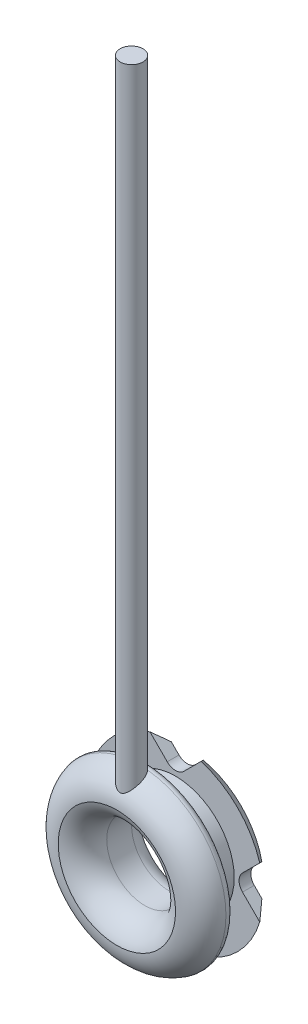
ISO-10303-21;
HEADER;
FILE_DESCRIPTION(('STEP AP214'),'2;1');
FILE_NAME('part.step','',(''),(''),'','','');
FILE_SCHEMA(('AUTOMOTIVE_DESIGN { 1 0 10303 214 1 1 1 1 }'));
ENDSEC;
DATA;
#1=APPLICATION_CONTEXT('core data for automotive mechanical design processes');
#2=APPLICATION_PROTOCOL_DEFINITION('international standard','automotive_design',2000,#1);
#3=PRODUCT_CONTEXT('',#1,'mechanical');
#4=PRODUCT('Part','Part','',(#3));
#5=PRODUCT_RELATED_PRODUCT_CATEGORY('part','',(#4));
#6=PRODUCT_DEFINITION_FORMATION('','',#4);
#7=PRODUCT_DEFINITION_CONTEXT('part definition',#1,'design');
#8=PRODUCT_DEFINITION('design','',#6,#7);
#9=PRODUCT_DEFINITION_SHAPE('','',#8);
#10=(LENGTH_UNIT() NAMED_UNIT(*) SI_UNIT(.MILLI.,.METRE.));
#11=(NAMED_UNIT(*) PLANE_ANGLE_UNIT() SI_UNIT($,.RADIAN.));
#12=(NAMED_UNIT(*) SI_UNIT($,.STERADIAN.) SOLID_ANGLE_UNIT());
#13=UNCERTAINTY_MEASURE_WITH_UNIT(LENGTH_MEASURE(1.E-05),#10,'distance_accuracy_value','');
#14=(GEOMETRIC_REPRESENTATION_CONTEXT(3) GLOBAL_UNCERTAINTY_ASSIGNED_CONTEXT((#13)) GLOBAL_UNIT_ASSIGNED_CONTEXT((#10,
#11,#12)) REPRESENTATION_CONTEXT('',''));
#15=CARTESIAN_POINT('',(0.,0.,0.));
#16=DIRECTION('',(0.,0.,1.));
#17=DIRECTION('',(1.,0.,0.));
#18=AXIS2_PLACEMENT_3D('',#15,#16,#17);
#19=CARTESIAN_POINT('',(0.,0.,0.5));
#20=DIRECTION('',(0.,0.,1.));
#21=DIRECTION('',(1.,0.,0.));
#22=AXIS2_PLACEMENT_3D('',#19,#20,#21);
#23=TOROIDAL_SURFACE('',#22,1.,0.5);
#24=CARTESIAN_POINT('',(0.,0.,1.));
#25=DIRECTION('',(0.,0.,1.));
#26=DIRECTION('',(1.,0.,0.));
#27=AXIS2_PLACEMENT_3D('',#24,#25,#26);
#28=CIRCLE('',#27,1.);
#29=CARTESIAN_POINT('',(1.,0.,1.));
#30=VERTEX_POINT('',#29);
#31=EDGE_CURVE('E190',#30,#30,#28,.T.);
#32=ORIENTED_EDGE('',*,*,#31,.F.);
#33=EDGE_LOOP('',(#32));
#34=FACE_BOUND('',#33,.T.);
#35=CARTESIAN_POINT('',(0.,0.,0.625));
#36=DIRECTION('',(0.,0.,-1.));
#37=DIRECTION('',(-1.,0.,0.));
#38=AXIS2_PLACEMENT_3D('',#35,#36,#37);
#39=CIRCLE('',#38,1.48412291827593);
#40=CARTESIAN_POINT('',(-0.149666295471074,1.4765570888225,0.625000000000124));
#41=VERTEX_POINT('',#40);
#42=CARTESIAN_POINT('',(0.149666295470958,1.47655708882246,0.625));
#43=VERTEX_POINT('',#42);
#44=EDGE_CURVE('E178',#41,#43,#39,.F.);
#45=ORIENTED_EDGE('',*,*,#44,.T.);
#46=CARTESIAN_POINT('',(0.149499030097189,1.4766258930363,0.6248));
#47=CARTESIAN_POINT('',(0.156696979301683,1.47368439659809,0.633374210355111));
#48=CARTESIAN_POINT('',(0.163061163340651,1.47036924902463,0.642493157271564));
#49=CARTESIAN_POINT('',(0.174047735758035,1.46302975629054,0.661400727866024));
#50=CARTESIAN_POINT('',(0.178678670944253,1.45900903864033,0.671185776576574));
#51=CARTESIAN_POINT('',(0.18619214272015,1.45027271715954,0.691085184626072));
#52=CARTESIAN_POINT('',(0.189077079156947,1.44555807825158,0.70119907172825));
#53=CARTESIAN_POINT('',(0.193175666338337,1.43548661995578,0.721452113909226));
#54=CARTESIAN_POINT('',(0.194387549544925,1.43012912789266,0.73159128439135));
#55=CARTESIAN_POINT('',(0.195285259185459,1.41840539297856,0.752416545205257));
#56=CARTESIAN_POINT('',(0.1948417092643,1.41199277931789,0.763081788000562));
#57=CARTESIAN_POINT('',(0.192322492696541,1.39863478916131,0.783863720708152));
#58=CARTESIAN_POINT('',(0.190246519586124,1.39168931284912,0.793980307236911));
#59=CARTESIAN_POINT('',(0.184218211370251,1.3762765318613,0.815008926716112));
#60=CARTESIAN_POINT('',(0.180024816348121,1.36774025963456,0.825801014695187));
#61=CARTESIAN_POINT('',(0.169962407236064,1.35030479558493,0.846271482068112));
#62=CARTESIAN_POINT('',(0.164090682173478,1.34140503672721,0.855948023764908));
#63=CARTESIAN_POINT('',(0.149708057905441,1.32192072218834,0.875642552382461));
#64=CARTESIAN_POINT('',(0.140916387586312,1.31131089452762,0.885430351700753));
#65=CARTESIAN_POINT('',(0.121378412897694,1.29038168528772,0.903189528623968));
#66=CARTESIAN_POINT('',(0.110635727001244,1.28006180619781,0.911164208301203));
#67=CARTESIAN_POINT('',(0.0928839133125625,1.26549418342858,0.921593397056493));
#68=CARTESIAN_POINT('',(0.086694043734059,1.26079056350767,0.92481419340766));
#69=CARTESIAN_POINT('',(0.0736890564923208,1.25190584251148,0.930681603016248));
#70=CARTESIAN_POINT('',(0.0668744348373626,1.24772433304259,0.933328666254309));
#71=CARTESIAN_POINT('',(0.0539396234627459,1.24095134875973,0.937489467275872));
#72=CARTESIAN_POINT('',(0.0479390439805197,1.23820875183827,0.939123324726593));
#73=CARTESIAN_POINT('',(0.0355055147174685,1.23355803913689,0.941845186746187));
#74=CARTESIAN_POINT('',(0.0290736112385078,1.23164798265763,0.942934461649758));
#75=CARTESIAN_POINT('',(0.0171465296035864,1.22920053941878,0.944319043688463));
#76=CARTESIAN_POINT('',(0.0117044602388746,1.22847177519864,0.944725601789662));
#77=CARTESIAN_POINT('',(0.000758519440309293,1.22784572312433,0.945075211732738));
#78=CARTESIAN_POINT('',(-0.00474531146339857,1.22794791856991,0.945018551608893));
#79=CARTESIAN_POINT('',(-0.0156355429490688,1.22896676377188,0.944448546746555));
#80=CARTESIAN_POINT('',(-0.0210222032834489,1.2298813715348,0.943936347000104));
#81=CARTESIAN_POINT('',(-0.0315728581818736,1.23240573184491,0.94250091794956));
#82=CARTESIAN_POINT('',(-0.0367365677026245,1.23401634688864,0.941577178618949));
#83=CARTESIAN_POINT('',(-0.0497794695040224,1.23890064991985,0.938718036435945));
#84=CARTESIAN_POINT('',(-0.0574394637752494,1.24259315862571,0.936507898114206));
#85=CARTESIAN_POINT('',(-0.0720362078583338,1.25082050883386,0.931372588774388));
#86=CARTESIAN_POINT('',(-0.078970212376156,1.25535837921679,0.928444834280621));
#87=CARTESIAN_POINT('',(-0.0969865294664841,1.26838595352085,0.919647234114758));
#88=CARTESIAN_POINT('',(-0.107430158662038,1.27735484190092,0.913183608903892));
#89=CARTESIAN_POINT('',(-0.126677041761067,1.29578676130787,0.89873596026507));
#90=CARTESIAN_POINT('',(-0.13547820299235,1.30525040332337,0.890750023077778));
#91=CARTESIAN_POINT('',(-0.151940401398813,1.32476765329214,0.872861381991615));
#92=CARTESIAN_POINT('',(-0.159508275145962,1.33482423712595,0.862875565706607));
#93=CARTESIAN_POINT('',(-0.172692641491739,1.35462932692126,0.841434374478199));
#94=CARTESIAN_POINT('',(-0.178311247236968,1.36437815601949,0.829980609466349));
#95=CARTESIAN_POINT('',(-0.186878535487946,1.38241093404366,0.806905846211039));
#96=CARTESIAN_POINT('',(-0.190027699364597,1.39074663078586,0.795400562919765));
#97=CARTESIAN_POINT('',(-0.19418294361917,1.40674549798854,0.771548535870156));
#98=CARTESIAN_POINT('',(-0.195189004334693,1.41440866227809,0.759201784392649));
#99=CARTESIAN_POINT('',(-0.194750510114056,1.42893266753431,0.733929026444996));
#100=CARTESIAN_POINT('',(-0.193284609893565,1.43578596767769,0.720998922550205));
#101=CARTESIAN_POINT('',(-0.18761240397004,1.44843115147158,0.695230746926723));
#102=CARTESIAN_POINT('',(-0.183412294670209,1.45422539726877,0.682392533300973));
#103=CARTESIAN_POINT('',(-0.174224946408738,1.46277755824538,0.661981538374541));
#104=CARTESIAN_POINT('',(-0.170062400883219,1.46587851139698,0.654173900109877));
#105=CARTESIAN_POINT('',(-0.160614637583342,1.47160878314234,0.639058843665036));
#106=CARTESIAN_POINT('',(-0.155327117243196,1.47423711371215,0.631752492695069));
#107=CARTESIAN_POINT('',(-0.149499030097188,1.4766258930363,0.6248));
#108=B_SPLINE_CURVE_WITH_KNOTS('',3,(#46,#47,#48,#49,#50,#51,#52,#53,#54,#55,#56,#57,#58,#59,
#60,#61,#62,#63,#64,#65,#66,#67,#68,#69,#70,#71,#72,#73,#74,#75,#76,#77,#78,#79,#80,#81,#82,#83,
#84,#85,#86,#87,#88,#89,#90,#91,#92,#93,#94,#95,#96,#97,#98,#99,#100,#101,#102,#103,#104,#105,
#106,#107),.UNSPECIFIED.,.F.,.F.,(4,2,2,2,2,2,2,2,2,2,2,2,2,2,2,2,2,2,2,2,2,2,2,2,2,2,2,2,2,2,
4),(0.,0.0346495677325266,0.0691259509289017,0.103554838631151,0.138020071810603,
0.175233219256427,0.212453354600247,0.255445602119331,0.298507690437271,0.349014482543497,
0.399428540897326,0.424632939280351,0.449817497665081,0.470144068097087,0.490422999373991,
0.506863847523982,0.523294473348444,0.539683917388232,0.556093729833186,0.582299956154269,
0.608601949601515,0.653979658112872,0.699414793527063,0.747430851072702,0.795394691905309,
0.838875015317358,0.882355737648071,0.926213839906042,0.969972893108465,0.998013247310488,
1.02611155551373),.UNSPECIFIED.);
#109=EDGE_CURVE('E51',#43,#41,#108,.T.);
#110=ORIENTED_EDGE('',*,*,#109,.T.);
#111=EDGE_LOOP('',(#45,#110));
#112=FACE_BOUND('',#111,.T.);
#113=ADVANCED_FACE('F32',(#34,#112),#23,.T.);
#114=CARTESIAN_POINT('',(0.,0.,0.6));
#115=DIRECTION('',(0.,0.,1.));
#116=DIRECTION('',(1.,0.,0.));
#117=AXIS2_PLACEMENT_3D('',#114,#115,#116);
#118=TOROIDAL_SURFACE('',#117,1.38729833462074,0.1);
#119=CARTESIAN_POINT('',(0.,0.,0.5));
#120=DIRECTION('',(0.,0.,1.));
#121=DIRECTION('',(1.,0.,0.));
#122=AXIS2_PLACEMENT_3D('',#119,#120,#121);
#123=CIRCLE('',#122,1.38729833462074);
#124=CARTESIAN_POINT('',(1.38729833462074,0.,0.5));
#125=VERTEX_POINT('',#124);
#126=EDGE_CURVE('E183',#125,#125,#123,.F.);
#127=ORIENTED_EDGE('',*,*,#126,.F.);
#128=EDGE_LOOP('',(#127));
#129=FACE_BOUND('',#128,.T.);
#130=ORIENTED_EDGE('',*,*,#44,.F.);
#131=CARTESIAN_POINT('',(-0.149833107155929,1.4764880444294,0.6252));
#132=CARTESIAN_POINT('',(-0.14452416364624,1.47869843083817,0.618800225346473));
#133=CARTESIAN_POINT('',(-0.138696516749939,1.48019238657561,0.612659136835366));
#134=CARTESIAN_POINT('',(-0.126257157565789,1.482100911887,0.601159814527972));
#135=CARTESIAN_POINT('',(-0.119653735409518,1.48252597042339,0.595794464203463));
#136=CARTESIAN_POINT('',(-0.104317452997589,1.48269590001264,0.584924281690223));
#137=CARTESIAN_POINT('',(-0.0954317691829694,1.48227517200432,0.579636747330142));
#138=CARTESIAN_POINT('',(-0.0769371796756487,1.48100259357276,0.570521935574666));
#139=CARTESIAN_POINT('',(-0.0673256050021827,1.48014907891991,0.566700395887298));
#140=CARTESIAN_POINT('',(-0.0474244773197394,1.47852782356893,0.560563163846049));
#141=CARTESIAN_POINT('',(-0.0371256063919043,1.47776198560329,0.558276971309993));
#142=CARTESIAN_POINT('',(-0.0162865143726189,1.47676246680102,0.555397846310613));
#143=CARTESIAN_POINT('',(-0.00574687436684022,1.47652761842958,0.554801198162191));
#144=CARTESIAN_POINT('',(0.0153544653302465,1.47671872238743,0.555317153479755));
#145=CARTESIAN_POINT('',(0.0259158350607343,1.47714913836621,0.556441302295828));
#146=CARTESIAN_POINT('',(0.0467146249399754,1.47843857552947,0.560381430899113));
#147=CARTESIAN_POINT('',(0.0569510989660962,1.47929874461609,0.56320194593968));
#148=CARTESIAN_POINT('',(0.0769739970457121,1.48096663938371,0.570513884552153));
#149=CARTESIAN_POINT('',(0.0867522842860845,1.4817734799595,0.575027778806194));
#150=CARTESIAN_POINT('',(0.105426896536981,1.48268861176828,0.5856093325553));
#151=CARTESIAN_POINT('',(0.114327402758475,1.48280038954247,0.591669078035132));
#152=CARTESIAN_POINT('',(0.127637832052235,1.48187173334083,0.602436994397496));
#153=CARTESIAN_POINT('',(0.132422709245339,1.48127316306675,0.606719967376661));
#154=CARTESIAN_POINT('',(0.141517332996463,1.47941791684281,0.615688853643923));
#155=CARTESIAN_POINT('',(0.145823741605626,1.47815693113135,0.620377235689106));
#156=CARTESIAN_POINT('',(0.149833107155929,1.4764880444294,0.6252));
#157=B_SPLINE_CURVE_WITH_KNOTS('',3,(#131,#132,#133,#134,#135,#136,#137,#138,#139,#140,#141,
#142,#143,#144,#145,#146,#147,#148,#149,#150,#151,#152,#153,#154,#155,#156),.UNSPECIFIED.,.F.,
.F.,(4,2,2,2,2,2,2,2,2,2,2,2,4),(0.,0.0256834918135602,0.0511139533848748,0.0820034292526581,
0.113012598066916,0.144601715795469,0.176121307848155,0.207853303222247,0.239670513901319,
0.271925789212535,0.304019135744154,0.32330946064791,0.342726874377861),.UNSPECIFIED.);
#158=EDGE_CURVE('E11',#41,#43,#157,.T.);
#159=ORIENTED_EDGE('',*,*,#158,.T.);
#160=EDGE_LOOP('',(#130,#159));
#161=FACE_BOUND('',#160,.T.);
#162=ADVANCED_FACE('F182',(#129,#161),#118,.T.);
#163=CARTESIAN_POINT('',(0.,0.,0.5));
#164=DIRECTION('',(0.,0.,-1.));
#165=DIRECTION('',(-1.,0.,0.));
#166=AXIS2_PLACEMENT_3D('',#163,#164,#165);
#167=CYLINDRICAL_SURFACE('',#166,1.);
#168=CARTESIAN_POINT('',(0.,0.,0.5));
#169=DIRECTION('',(0.,0.,1.));
#170=DIRECTION('',(1.,0.,0.));
#171=AXIS2_PLACEMENT_3D('',#168,#169,#170);
#172=CIRCLE('',#171,1.);
#173=CARTESIAN_POINT('',(1.,0.,0.5));
#174=VERTEX_POINT('',#173);
#175=EDGE_CURVE('E400',#174,#174,#172,.T.);
#176=ORIENTED_EDGE('',*,*,#175,.F.);
#177=EDGE_LOOP('',(#176));
#178=FACE_BOUND('',#177,.T.);
#179=CARTESIAN_POINT('',(0.,0.,0.));
#180=DIRECTION('',(0.,0.,1.));
#181=DIRECTION('',(1.,0.,0.));
#182=AXIS2_PLACEMENT_3D('',#179,#180,#181);
#183=CIRCLE('',#182,1.);
#184=CARTESIAN_POINT('',(1.,0.,0.));
#185=VERTEX_POINT('',#184);
#186=CARTESIAN_POINT('',(0.,1.,0.));
#187=VERTEX_POINT('',#186);
#188=EDGE_CURVE('E403',#185,#187,#183,.T.);
#189=ORIENTED_EDGE('',*,*,#188,.T.);
#190=CARTESIAN_POINT('',(-1.,0.,0.));
#191=VERTEX_POINT('',#190);
#192=EDGE_CURVE('E405',#187,#191,#183,.T.);
#193=ORIENTED_EDGE('',*,*,#192,.T.);
#194=CARTESIAN_POINT('',(0.,-1.,0.));
#195=VERTEX_POINT('',#194);
#196=EDGE_CURVE('E319',#191,#195,#183,.T.);
#197=ORIENTED_EDGE('',*,*,#196,.T.);
#198=EDGE_CURVE('E370',#195,#185,#183,.T.);
#199=ORIENTED_EDGE('',*,*,#198,.T.);
#200=EDGE_LOOP('',(#189,#193,#197,#199));
#201=FACE_BOUND('',#200,.T.);
#202=ADVANCED_FACE('F269',(#178,#201),#167,.T.);
#203=CARTESIAN_POINT('',(0.,0.,0.5));
#204=DIRECTION('',(0.,0.,-1.));
#205=DIRECTION('',(-1.,0.,0.));
#206=AXIS2_PLACEMENT_3D('',#203,#204,#205);
#207=CYLINDRICAL_SURFACE('',#206,0.65);
#208=CARTESIAN_POINT('',(0.,0.,0.0999999999999999));
#209=DIRECTION('',(0.,0.,-1.));
#210=DIRECTION('',(-1.,0.,0.));
#211=AXIS2_PLACEMENT_3D('',#208,#209,#210);
#212=CIRCLE('',#211,0.65);
#213=CARTESIAN_POINT('',(-0.65,0.,0.0999999999999999));
#214=VERTEX_POINT('',#213);
#215=EDGE_CURVE('E253',#214,#214,#212,.T.);
#216=ORIENTED_EDGE('',*,*,#215,.T.);
#217=EDGE_LOOP('',(#216));
#218=FACE_BOUND('',#217,.T.);
#219=CARTESIAN_POINT('',(0.,0.,0.523030399291527));
#220=DIRECTION('',(0.,0.,1.));
#221=DIRECTION('',(1.,0.,0.));
#222=AXIS2_PLACEMENT_3D('',#219,#220,#221);
#223=CIRCLE('',#222,0.65);
#224=CARTESIAN_POINT('',(0.65,0.,0.523030399291527));
#225=VERTEX_POINT('',#224);
#226=EDGE_CURVE('E184',#225,#225,#223,.T.);
#227=ORIENTED_EDGE('',*,*,#226,.T.);
#228=EDGE_LOOP('',(#227));
#229=FACE_BOUND('',#228,.T.);
#230=ADVANCED_FACE('F265',(#218,#229),#207,.F.);
#231=CARTESIAN_POINT('',(0.,0.,0.5));
#232=DIRECTION('',(0.,0.,1.));
#233=DIRECTION('',(1.,0.,0.));
#234=AXIS2_PLACEMENT_3D('',#231,#232,#233);
#235=PLANE('',#234);
#236=ORIENTED_EDGE('',*,*,#126,.T.);
#237=EDGE_LOOP('',(#236));
#238=FACE_BOUND('',#237,.T.);
#239=ORIENTED_EDGE('',*,*,#175,.T.);
#240=EDGE_LOOP('',(#239));
#241=FACE_BOUND('',#240,.T.);
#242=ADVANCED_FACE('F268',(#238,#241),#235,.F.);
#243=CARTESIAN_POINT('',(0.,0.,0.));
#244=DIRECTION('',(0.,0.,-1.));
#245=DIRECTION('',(-1.,0.,0.));
#246=AXIS2_PLACEMENT_3D('',#243,#244,#245);
#247=PLANE('',#246);
#248=ORIENTED_EDGE('',*,*,#196,.F.);
#249=ORIENTED_EDGE('',*,*,#192,.F.);
#250=ORIENTED_EDGE('',*,*,#188,.F.);
#251=ORIENTED_EDGE('',*,*,#198,.F.);
#252=EDGE_LOOP('',(#248,#249,#250,#251));
#253=FACE_BOUND('',#252,.T.);
#254=CARTESIAN_POINT('',(-1.28284271247462,0.,0.));
#255=DIRECTION('',(0.,0.,-1.));
#256=DIRECTION('',(-1.,0.,0.));
#257=AXIS2_PLACEMENT_3D('',#254,#255,#256);
#258=CIRCLE('',#257,0.2);
#259=CARTESIAN_POINT('',(-1.14142135623731,0.141421356237309,0.));
#260=VERTEX_POINT('',#259);
#261=CARTESIAN_POINT('',(-1.14142135623731,-0.141421356237309,0.));
#262=VERTEX_POINT('',#261);
#263=EDGE_CURVE('E324',#260,#262,#258,.T.);
#264=ORIENTED_EDGE('',*,*,#263,.T.);
#265=DIRECTION('',(0.707106781186546,0.707106781186549,0.));
#266=VECTOR('',#265,1.);
#267=CARTESIAN_POINT('',(-1.,0.,0.));
#268=LINE('',#267,#266);
#269=CARTESIAN_POINT('',(-1.43541434669349,-0.435414346693486,0.));
#270=VERTEX_POINT('',#269);
#271=EDGE_CURVE('E327',#270,#262,#268,.T.);
#272=ORIENTED_EDGE('',*,*,#271,.F.);
#273=CARTESIAN_POINT('',(0.,0.,0.));
#274=DIRECTION('',(0.,0.,-1.));
#275=DIRECTION('',(-1.,0.,0.));
#276=AXIS2_PLACEMENT_3D('',#273,#274,#275);
#277=CIRCLE('',#276,1.5);
#278=CARTESIAN_POINT('',(-0.435414346693492,-1.43541434669348,0.));
#279=VERTEX_POINT('',#278);
#280=EDGE_CURVE('E393',#279,#270,#277,.T.);
#281=ORIENTED_EDGE('',*,*,#280,.F.);
#282=DIRECTION('',(-0.707106781186554,-0.707106781186541,0.));
#283=VECTOR('',#282,1.);
#284=CARTESIAN_POINT('',(0.,-1.,0.));
#285=LINE('',#284,#283);
#286=CARTESIAN_POINT('',(-0.14142135623731,-1.14142135623731,0.));
#287=VERTEX_POINT('',#286);
#288=EDGE_CURVE('E391',#287,#279,#285,.T.);
#289=ORIENTED_EDGE('',*,*,#288,.F.);
#290=CARTESIAN_POINT('',(0.,-1.28284271247462,0.));
#291=DIRECTION('',(0.,0.,-1.));
#292=DIRECTION('',(-1.,0.,0.));
#293=AXIS2_PLACEMENT_3D('',#290,#291,#292);
#294=CIRCLE('',#293,0.2);
#295=CARTESIAN_POINT('',(0.141421356237308,-1.14142135623731,0.));
#296=VERTEX_POINT('',#295);
#297=EDGE_CURVE('E357',#287,#296,#294,.T.);
#298=ORIENTED_EDGE('',*,*,#297,.T.);
#299=DIRECTION('',(-0.707106781186544,0.707106781186551,0.));
#300=VECTOR('',#299,1.);
#301=CARTESIAN_POINT('',(0.,-1.,0.));
#302=LINE('',#301,#300);
#303=CARTESIAN_POINT('',(0.435414346693482,-1.43541434669349,0.));
#304=VERTEX_POINT('',#303);
#305=EDGE_CURVE('E389',#304,#296,#302,.T.);
#306=ORIENTED_EDGE('',*,*,#305,.F.);
#307=CARTESIAN_POINT('',(0.,0.,0.));
#308=DIRECTION('',(0.,0.,-1.));
#309=DIRECTION('',(-1.,0.,0.));
#310=AXIS2_PLACEMENT_3D('',#307,#308,#309);
#311=CIRCLE('',#310,1.5);
#312=CARTESIAN_POINT('',(1.43541434669348,-0.435414346693492,0.));
#313=VERTEX_POINT('',#312);
#314=EDGE_CURVE('E386',#313,#304,#311,.T.);
#315=ORIENTED_EDGE('',*,*,#314,.F.);
#316=DIRECTION('',(0.707106781186541,-0.707106781186554,0.));
#317=VECTOR('',#316,1.);
#318=CARTESIAN_POINT('',(1.,0.,0.));
#319=LINE('',#318,#317);
#320=CARTESIAN_POINT('',(1.14142135623731,-0.14142135623731,0.));
#321=VERTEX_POINT('',#320);
#322=EDGE_CURVE('E384',#321,#313,#319,.T.);
#323=ORIENTED_EDGE('',*,*,#322,.F.);
#324=CARTESIAN_POINT('',(1.28284271247462,0.,0.));
#325=DIRECTION('',(0.,0.,-1.));
#326=DIRECTION('',(-1.,0.,0.));
#327=AXIS2_PLACEMENT_3D('',#324,#325,#326);
#328=CIRCLE('',#327,0.2);
#329=CARTESIAN_POINT('',(1.14142135623731,0.141421356237308,0.));
#330=VERTEX_POINT('',#329);
#331=EDGE_CURVE('E352',#321,#330,#328,.T.);
#332=ORIENTED_EDGE('',*,*,#331,.T.);
#333=DIRECTION('',(-0.707106781186551,-0.707106781186544,0.));
#334=VECTOR('',#333,1.);
#335=CARTESIAN_POINT('',(1.,0.,0.));
#336=LINE('',#335,#334);
#337=CARTESIAN_POINT('',(1.43541434669349,0.435414346693482,0.));
#338=VERTEX_POINT('',#337);
#339=EDGE_CURVE('E382',#338,#330,#336,.T.);
#340=ORIENTED_EDGE('',*,*,#339,.F.);
#341=CARTESIAN_POINT('',(0.,0.,0.));
#342=DIRECTION('',(0.,0.,-1.));
#343=DIRECTION('',(-1.,0.,0.));
#344=AXIS2_PLACEMENT_3D('',#341,#342,#343);
#345=CIRCLE('',#344,1.5);
#346=CARTESIAN_POINT('',(0.435414346693487,1.43541434669348,0.));
#347=VERTEX_POINT('',#346);
#348=EDGE_CURVE('E379',#347,#338,#345,.T.);
#349=ORIENTED_EDGE('',*,*,#348,.F.);
#350=DIRECTION('',(0.707106781186549,0.707106781186546,0.));
#351=VECTOR('',#350,1.);
#352=CARTESIAN_POINT('',(0.,1.,0.));
#353=LINE('',#352,#351);
#354=CARTESIAN_POINT('',(0.141421356237309,1.14142135623731,0.));
#355=VERTEX_POINT('',#354);
#356=EDGE_CURVE('E377',#355,#347,#353,.T.);
#357=ORIENTED_EDGE('',*,*,#356,.F.);
#358=CARTESIAN_POINT('',(0.,1.28284271247462,0.));
#359=DIRECTION('',(0.,0.,-1.));
#360=DIRECTION('',(-1.,0.,0.));
#361=AXIS2_PLACEMENT_3D('',#358,#359,#360);
#362=CIRCLE('',#361,0.2);
#363=CARTESIAN_POINT('',(-0.141421356237309,1.14142135623731,0.));
#364=VERTEX_POINT('',#363);
#365=EDGE_CURVE('E341',#355,#364,#362,.T.);
#366=ORIENTED_EDGE('',*,*,#365,.T.);
#367=DIRECTION('',(0.707106781186549,-0.707106781186546,0.));
#368=VECTOR('',#367,1.);
#369=CARTESIAN_POINT('',(0.,1.,0.));
#370=LINE('',#369,#368);
#371=CARTESIAN_POINT('',(-0.435414346693486,1.43541434669348,0.));
#372=VERTEX_POINT('',#371);
#373=EDGE_CURVE('E179',#372,#364,#370,.T.);
#374=ORIENTED_EDGE('',*,*,#373,.F.);
#375=CARTESIAN_POINT('',(0.,0.,0.));
#376=DIRECTION('',(0.,0.,-1.));
#377=DIRECTION('',(-1.,0.,0.));
#378=AXIS2_PLACEMENT_3D('',#375,#376,#377);
#379=CIRCLE('',#378,1.5);
#380=CARTESIAN_POINT('',(-1.43541434669348,0.435414346693487,0.));
#381=VERTEX_POINT('',#380);
#382=EDGE_CURVE('E397',#381,#372,#379,.T.);
#383=ORIENTED_EDGE('',*,*,#382,.F.);
#384=DIRECTION('',(-0.707106781186546,0.707106781186549,0.));
#385=VECTOR('',#384,1.);
#386=CARTESIAN_POINT('',(-1.,0.,0.));
#387=LINE('',#386,#385);
#388=EDGE_CURVE('E330',#260,#381,#387,.T.);
#389=ORIENTED_EDGE('',*,*,#388,.F.);
#390=EDGE_LOOP('',(#264,#272,#281,#289,#298,#306,#315,#323,#332,#340,#349,#357,#366,#374,#383,#389));
#391=FACE_BOUND('',#390,.T.);
#392=ADVANCED_FACE('F309',(#253,#391),#247,.F.);
#393=CARTESIAN_POINT('',(0.,0.,-0.2));
#394=DIRECTION('',(0.,0.,-1.));
#395=DIRECTION('',(-1.,0.,0.));
#396=AXIS2_PLACEMENT_3D('',#393,#394,#395);
#397=PLANE('',#396);
#398=CARTESIAN_POINT('',(0.,0.,-0.2));
#399=DIRECTION('',(0.,0.,-1.));
#400=DIRECTION('',(-1.,0.,0.));
#401=AXIS2_PLACEMENT_3D('',#398,#399,#400);
#402=CIRCLE('',#401,0.95);
#403=CARTESIAN_POINT('',(-0.95,0.,-0.2));
#404=VERTEX_POINT('',#403);
#405=EDGE_CURVE('E45',#404,#404,#402,.F.);
#406=ORIENTED_EDGE('',*,*,#405,.T.);
#407=EDGE_LOOP('',(#406));
#408=FACE_BOUND('',#407,.T.);
#409=DIRECTION('',(-0.707106781186554,-0.707106781186541,0.));
#410=VECTOR('',#409,1.);
#411=CARTESIAN_POINT('',(0.,-1.,-0.2));
#412=LINE('',#411,#410);
#413=CARTESIAN_POINT('',(-0.14142135623731,-1.14142135623731,-0.2));
#414=VERTEX_POINT('',#413);
#415=CARTESIAN_POINT('',(-0.23621335308983,-1.23621335308983,-0.2));
#416=VERTEX_POINT('',#415);
#417=EDGE_CURVE('E366',#414,#416,#412,.T.);
#418=ORIENTED_EDGE('',*,*,#417,.T.);
#419=CARTESIAN_POINT('',(0.,0.,-0.2));
#420=DIRECTION('',(0.,0.,-1.));
#421=DIRECTION('',(-1.,0.,0.));
#422=AXIS2_PLACEMENT_3D('',#419,#420,#421);
#423=CIRCLE('',#422,1.25857864376269);
#424=CARTESIAN_POINT('',(-1.23621335308983,-0.236213353089828,-0.2));
#425=VERTEX_POINT('',#424);
#426=EDGE_CURVE('E237',#416,#425,#423,.T.);
#427=ORIENTED_EDGE('',*,*,#426,.T.);
#428=DIRECTION('',(0.707106781186546,0.707106781186549,0.));
#429=VECTOR('',#428,1.);
#430=CARTESIAN_POINT('',(-1.,0.,-0.2));
#431=LINE('',#430,#429);
#432=CARTESIAN_POINT('',(-1.14142135623731,-0.141421356237309,-0.2));
#433=VERTEX_POINT('',#432);
#434=EDGE_CURVE('E364',#425,#433,#431,.T.);
#435=ORIENTED_EDGE('',*,*,#434,.T.);
#436=CARTESIAN_POINT('',(-1.28284271247462,0.,-0.2));
#437=DIRECTION('',(0.,0.,-1.));
#438=DIRECTION('',(-1.,0.,0.));
#439=AXIS2_PLACEMENT_3D('',#436,#437,#438);
#440=CIRCLE('',#439,0.2);
#441=CARTESIAN_POINT('',(-1.14142135623731,0.141421356237309,-0.2));
#442=VERTEX_POINT('',#441);
#443=EDGE_CURVE('E334',#433,#442,#440,.F.);
#444=ORIENTED_EDGE('',*,*,#443,.T.);
#445=DIRECTION('',(-0.707106781186546,0.707106781186549,0.));
#446=VECTOR('',#445,1.);
#447=CARTESIAN_POINT('',(-1.,0.,-0.2));
#448=LINE('',#447,#446);
#449=CARTESIAN_POINT('',(-1.27136243102708,0.271362431027076,-0.2));
#450=VERTEX_POINT('',#449);
#451=EDGE_CURVE('E368',#442,#450,#448,.T.);
#452=ORIENTED_EDGE('',*,*,#451,.T.);
#453=CARTESIAN_POINT('',(0.,0.,-0.2));
#454=DIRECTION('',(0.,0.,-1.));
#455=DIRECTION('',(-1.,0.,0.));
#456=AXIS2_PLACEMENT_3D('',#453,#454,#455);
#457=CIRCLE('',#456,1.3);
#458=CARTESIAN_POINT('',(-0.271362431027076,1.27136243102708,-0.2));
#459=VERTEX_POINT('',#458);
#460=EDGE_CURVE('E199',#450,#459,#457,.T.);
#461=ORIENTED_EDGE('',*,*,#460,.T.);
#462=DIRECTION('',(0.707106781186549,-0.707106781186546,0.));
#463=VECTOR('',#462,1.);
#464=CARTESIAN_POINT('',(0.,1.,-0.2));
#465=LINE('',#464,#463);
#466=CARTESIAN_POINT('',(-0.141421356237309,1.14142135623731,-0.2));
#467=VERTEX_POINT('',#466);
#468=EDGE_CURVE('E299',#459,#467,#465,.T.);
#469=ORIENTED_EDGE('',*,*,#468,.T.);
#470=CARTESIAN_POINT('',(0.,1.28284271247462,-0.2));
#471=DIRECTION('',(0.,0.,-1.));
#472=DIRECTION('',(-1.,0.,0.));
#473=AXIS2_PLACEMENT_3D('',#470,#471,#472);
#474=CIRCLE('',#473,0.2);
#475=CARTESIAN_POINT('',(0.141421356237309,1.14142135623731,-0.2));
#476=VERTEX_POINT('',#475);
#477=EDGE_CURVE('E345',#467,#476,#474,.F.);
#478=ORIENTED_EDGE('',*,*,#477,.T.);
#479=DIRECTION('',(0.707106781186549,0.707106781186546,0.));
#480=VECTOR('',#479,1.);
#481=CARTESIAN_POINT('',(0.,1.,-0.2));
#482=LINE('',#481,#480);
#483=CARTESIAN_POINT('',(0.271362431027076,1.27136243102708,-0.2));
#484=VERTEX_POINT('',#483);
#485=EDGE_CURVE('E696',#476,#484,#482,.T.);
#486=ORIENTED_EDGE('',*,*,#485,.T.);
#487=CARTESIAN_POINT('',(0.,0.,-0.2));
#488=DIRECTION('',(0.,0.,-1.));
#489=DIRECTION('',(-1.,0.,0.));
#490=AXIS2_PLACEMENT_3D('',#487,#488,#489);
#491=CIRCLE('',#490,1.3);
#492=CARTESIAN_POINT('',(1.27136243102708,0.271362431027073,-0.2));
#493=VERTEX_POINT('',#492);
#494=EDGE_CURVE('E196',#484,#493,#491,.T.);
#495=ORIENTED_EDGE('',*,*,#494,.T.);
#496=DIRECTION('',(-0.707106781186551,-0.707106781186544,0.));
#497=VECTOR('',#496,1.);
#498=CARTESIAN_POINT('',(1.,0.,-0.2));
#499=LINE('',#498,#497);
#500=CARTESIAN_POINT('',(1.14142135623731,0.141421356237308,-0.2));
#501=VERTEX_POINT('',#500);
#502=EDGE_CURVE('E694',#493,#501,#499,.T.);
#503=ORIENTED_EDGE('',*,*,#502,.T.);
#504=CARTESIAN_POINT('',(1.28284271247462,0.,-0.2));
#505=DIRECTION('',(0.,0.,-1.));
#506=DIRECTION('',(-1.,0.,0.));
#507=AXIS2_PLACEMENT_3D('',#504,#505,#506);
#508=CIRCLE('',#507,0.2);
#509=CARTESIAN_POINT('',(1.14142135623731,-0.14142135623731,-0.2));
#510=VERTEX_POINT('',#509);
#511=EDGE_CURVE('E355',#501,#510,#508,.F.);
#512=ORIENTED_EDGE('',*,*,#511,.T.);
#513=DIRECTION('',(0.707106781186541,-0.707106781186554,0.));
#514=VECTOR('',#513,1.);
#515=CARTESIAN_POINT('',(1.,0.,-0.2));
#516=LINE('',#515,#514);
#517=CARTESIAN_POINT('',(1.27136243102707,-0.27136243102708,-0.2));
#518=VERTEX_POINT('',#517);
#519=EDGE_CURVE('E681',#510,#518,#516,.T.);
#520=ORIENTED_EDGE('',*,*,#519,.T.);
#521=CARTESIAN_POINT('',(0.,0.,-0.2));
#522=DIRECTION('',(0.,0.,-1.));
#523=DIRECTION('',(-1.,0.,0.));
#524=AXIS2_PLACEMENT_3D('',#521,#522,#523);
#525=CIRCLE('',#524,1.3);
#526=CARTESIAN_POINT('',(0.271362431027073,-1.27136243102708,-0.2));
#527=VERTEX_POINT('',#526);
#528=EDGE_CURVE('E187',#518,#527,#525,.T.);
#529=ORIENTED_EDGE('',*,*,#528,.T.);
#530=DIRECTION('',(-0.707106781186544,0.707106781186551,0.));
#531=VECTOR('',#530,1.);
#532=CARTESIAN_POINT('',(0.,-1.,-0.2));
#533=LINE('',#532,#531);
#534=CARTESIAN_POINT('',(0.141421356237308,-1.14142135623731,-0.2));
#535=VERTEX_POINT('',#534);
#536=EDGE_CURVE('E372',#527,#535,#533,.T.);
#537=ORIENTED_EDGE('',*,*,#536,.T.);
#538=CARTESIAN_POINT('',(0.,-1.28284271247462,-0.2));
#539=DIRECTION('',(0.,0.,-1.));
#540=DIRECTION('',(-1.,0.,0.));
#541=AXIS2_PLACEMENT_3D('',#538,#539,#540);
#542=CIRCLE('',#541,0.2);
#543=EDGE_CURVE('E335',#535,#414,#542,.F.);
#544=ORIENTED_EDGE('',*,*,#543,.T.);
#545=EDGE_LOOP('',(#418,#427,#435,#444,#452,#461,#469,#478,#486,#495,#503,#512,#520,#529,#537,#544));
#546=FACE_BOUND('',#545,.T.);
#547=ADVANCED_FACE('F258',(#408,#546),#397,.T.);
#548=CARTESIAN_POINT('',(0.,1.,-0.2));
#549=DIRECTION('',(-0.707106781186546,-0.707106781186549,0.));
#550=DIRECTION('',(0.707106781186549,-0.707106781186546,0.));
#551=AXIS2_PLACEMENT_3D('',#548,#549,#550);
#552=PLANE('',#551);
#553=ORIENTED_EDGE('',*,*,#373,.T.);
#554=DIRECTION('',(0.,0.,1.));
#555=VECTOR('',#554,1.);
#556=CARTESIAN_POINT('',(-0.141421356237309,1.14142135623731,-0.2));
#557=LINE('',#556,#555);
#558=EDGE_CURVE('E667',#364,#467,#557,.F.);
#559=ORIENTED_EDGE('',*,*,#558,.T.);
#560=ORIENTED_EDGE('',*,*,#468,.F.);
#561=CARTESIAN_POINT('',(-0.271362431027076,1.27136243102708,-0.2));
#562=CARTESIAN_POINT('',(-0.28518935763174,1.28518935763174,-0.183590576904373));
#563=CARTESIAN_POINT('',(-0.298971344360146,1.29897134436015,-0.167105673335265));
#564=CARTESIAN_POINT('',(-0.326454206910643,1.32645420691064,-0.134002619856901));
#565=CARTESIAN_POINT('',(-0.340155085745735,1.34015508574573,-0.117384474951987));
#566=CARTESIAN_POINT('',(-0.367485429682946,1.36748542968294,-0.0840315509879362));
#567=CARTESIAN_POINT('',(-0.381114895328296,1.38111489532829,-0.067296772818277));
#568=CARTESIAN_POINT('',(-0.408310438899732,1.40831043889973,-0.0337230524877311));
#569=CARTESIAN_POINT('',(-0.421876514439273,1.42187651443927,-0.0168841064596627));
#570=CARTESIAN_POINT('',(-0.435414346693488,1.43541434669349,0.));
#571=B_SPLINE_CURVE_WITH_KNOTS('',3,(#561,#562,#563,#564,#565,#566,#567,#568,#569,#570),
.UNSPECIFIED.,.F.,.F.,(4,2,2,2,4),(0.,0.0765811171151188,0.153159371308492,0.229737042131764,
0.3063175731324),.UNSPECIFIED.);
#572=EDGE_CURVE('E619',#459,#372,#571,.T.);
#573=ORIENTED_EDGE('',*,*,#572,.T.);
#574=EDGE_LOOP('',(#553,#559,#560,#573));
#575=FACE_BOUND('',#574,.T.);
#576=ADVANCED_FACE('F308',(#575),#552,.F.);
#577=CARTESIAN_POINT('',(0.,1.,-0.2));
#578=DIRECTION('',(0.707106781186546,-0.707106781186549,0.));
#579=DIRECTION('',(0.707106781186549,0.707106781186546,0.));
#580=AXIS2_PLACEMENT_3D('',#577,#578,#579);
#581=PLANE('',#580);
#582=ORIENTED_EDGE('',*,*,#485,.F.);
#583=DIRECTION('',(0.,0.,1.));
#584=VECTOR('',#583,1.);
#585=CARTESIAN_POINT('',(0.141421356237309,1.14142135623731,0.));
#586=LINE('',#585,#584);
#587=EDGE_CURVE('E662',#476,#355,#586,.T.);
#588=ORIENTED_EDGE('',*,*,#587,.T.);
#589=ORIENTED_EDGE('',*,*,#356,.T.);
#590=CARTESIAN_POINT('',(0.435414346693487,1.43541434669348,0.));
#591=CARTESIAN_POINT('',(0.421876514439273,1.42187651443927,-0.0168841064596609));
#592=CARTESIAN_POINT('',(0.408310438899732,1.40831043889973,-0.0337230524877301));
#593=CARTESIAN_POINT('',(0.381114895328296,1.38111489532829,-0.0672967728182769));
#594=CARTESIAN_POINT('',(0.367485429682946,1.36748542968294,-0.084031550987936));
#595=CARTESIAN_POINT('',(0.340155085745736,1.34015508574573,-0.117384474951987));
#596=CARTESIAN_POINT('',(0.326454206910643,1.32645420691064,-0.1340026198569));
#597=CARTESIAN_POINT('',(0.298971344360147,1.29897134436015,-0.167105673335266));
#598=CARTESIAN_POINT('',(0.285189357631741,1.28518935763174,-0.183590576904375));
#599=CARTESIAN_POINT('',(0.27136243102708,1.27136243102708,-0.200000000000006));
#600=B_SPLINE_CURVE_WITH_KNOTS('',3,(#590,#591,#592,#593,#594,#595,#596,#597,#598,#599),
.UNSPECIFIED.,.F.,.F.,(4,2,2,2,4),(0.,0.0765805310006362,0.153158201823909,0.229736456017282,
0.306317573132401),.UNSPECIFIED.);
#601=EDGE_CURVE('E638',#347,#484,#600,.T.);
#602=ORIENTED_EDGE('',*,*,#601,.T.);
#603=EDGE_LOOP('',(#582,#588,#589,#602));
#604=FACE_BOUND('',#603,.T.);
#605=ADVANCED_FACE('F475',(#604),#581,.F.);
#606=CARTESIAN_POINT('',(1.,0.,-0.2));
#607=DIRECTION('',(-0.707106781186544,0.707106781186551,0.));
#608=DIRECTION('',(-0.707106781186551,-0.707106781186544,0.));
#609=AXIS2_PLACEMENT_3D('',#606,#607,#608);
#610=PLANE('',#609);
#611=ORIENTED_EDGE('',*,*,#339,.T.);
#612=DIRECTION('',(0.,0.,1.));
#613=VECTOR('',#612,1.);
#614=CARTESIAN_POINT('',(1.14142135623731,0.141421356237308,-0.2));
#615=LINE('',#614,#613);
#616=EDGE_CURVE('E672',#330,#501,#615,.F.);
#617=ORIENTED_EDGE('',*,*,#616,.T.);
#618=ORIENTED_EDGE('',*,*,#502,.F.);
#619=CARTESIAN_POINT('',(1.27136243102708,0.271362431027073,-0.2));
#620=CARTESIAN_POINT('',(1.28518935763174,0.285189357631736,-0.183590576904373));
#621=CARTESIAN_POINT('',(1.29897134436015,0.298971344360143,-0.167105673335265));
#622=CARTESIAN_POINT('',(1.32645420691064,0.326454206910639,-0.1340026198569));
#623=CARTESIAN_POINT('',(1.34015508574574,0.340155085745732,-0.117384474951987));
#624=CARTESIAN_POINT('',(1.36748542968295,0.367485429682942,-0.0840315509879357));
#625=CARTESIAN_POINT('',(1.3811148953283,0.381114895328291,-0.0672967728182765));
#626=CARTESIAN_POINT('',(1.40831043889973,0.408310438899728,-0.0337230524877304));
#627=CARTESIAN_POINT('',(1.42187651443927,0.421876514439269,-0.016884106459662));
#628=CARTESIAN_POINT('',(1.43541434669349,0.435414346693483,0.));
#629=B_SPLINE_CURVE_WITH_KNOTS('',3,(#619,#620,#621,#622,#623,#624,#625,#626,#627,#628),
.UNSPECIFIED.,.F.,.F.,(4,2,2,2,4),(0.,0.076581117115119,0.153159371308492,0.229737042131765,
0.306317573132401),.UNSPECIFIED.);
#630=EDGE_CURVE('E624',#493,#338,#629,.T.);
#631=ORIENTED_EDGE('',*,*,#630,.T.);
#632=EDGE_LOOP('',(#611,#617,#618,#631));
#633=FACE_BOUND('',#632,.T.);
#634=ADVANCED_FACE('F485',(#633),#610,.F.);
#635=CARTESIAN_POINT('',(1.,0.,-0.2));
#636=DIRECTION('',(-0.707106781186554,-0.707106781186541,0.));
#637=DIRECTION('',(0.707106781186541,-0.707106781186554,0.));
#638=AXIS2_PLACEMENT_3D('',#635,#636,#637);
#639=PLANE('',#638);
#640=ORIENTED_EDGE('',*,*,#519,.F.);
#641=DIRECTION('',(0.,0.,1.));
#642=VECTOR('',#641,1.);
#643=CARTESIAN_POINT('',(1.14142135623731,-0.14142135623731,0.));
#644=LINE('',#643,#642);
#645=EDGE_CURVE('E669',#510,#321,#644,.T.);
#646=ORIENTED_EDGE('',*,*,#645,.T.);
#647=ORIENTED_EDGE('',*,*,#322,.T.);
#648=CARTESIAN_POINT('',(1.43541434669348,-0.435414346693492,0.));
#649=CARTESIAN_POINT('',(1.42187651443927,-0.421876514439277,-0.0168841064596612));
#650=CARTESIAN_POINT('',(1.40831043889973,-0.408310438899737,-0.0337230524877303));
#651=CARTESIAN_POINT('',(1.38111489532829,-0.3811148953283,-0.067296772818277));
#652=CARTESIAN_POINT('',(1.36748542968294,-0.367485429682951,-0.0840315509879361));
#653=CARTESIAN_POINT('',(1.34015508574573,-0.34015508574574,-0.117384474951987));
#654=CARTESIAN_POINT('',(1.32645420691064,-0.326454206910647,-0.1340026198569));
#655=CARTESIAN_POINT('',(1.29897134436014,-0.29897134436015,-0.167105673335266));
#656=CARTESIAN_POINT('',(1.28518935763174,-0.285189357631745,-0.183590576904375));
#657=CARTESIAN_POINT('',(1.27136243102708,-0.271362431027083,-0.200000000000006));
#658=B_SPLINE_CURVE_WITH_KNOTS('',3,(#648,#649,#650,#651,#652,#653,#654,#655,#656,#657),
.UNSPECIFIED.,.F.,.F.,(4,2,2,2,4),(0.,0.0765805310006361,0.153158201823909,0.229736456017282,
0.306317573132401),.UNSPECIFIED.);
#659=EDGE_CURVE('E656',#313,#518,#658,.T.);
#660=ORIENTED_EDGE('',*,*,#659,.T.);
#661=EDGE_LOOP('',(#640,#646,#647,#660));
#662=FACE_BOUND('',#661,.T.);
#663=ADVANCED_FACE('F495',(#662),#639,.F.);
#664=CARTESIAN_POINT('',(0.,-1.,-0.2));
#665=DIRECTION('',(0.707106781186551,0.707106781186544,0.));
#666=DIRECTION('',(-0.707106781186544,0.707106781186551,0.));
#667=AXIS2_PLACEMENT_3D('',#664,#665,#666);
#668=PLANE('',#667);
#669=ORIENTED_EDGE('',*,*,#305,.T.);
#670=DIRECTION('',(0.,0.,1.));
#671=VECTOR('',#670,1.);
#672=CARTESIAN_POINT('',(0.141421356237308,-1.14142135623731,-0.2));
#673=LINE('',#672,#671);
#674=EDGE_CURVE('E347',#296,#535,#673,.F.);
#675=ORIENTED_EDGE('',*,*,#674,.T.);
#676=ORIENTED_EDGE('',*,*,#536,.F.);
#677=CARTESIAN_POINT('',(0.271362431027073,-1.27136243102708,-0.2));
#678=CARTESIAN_POINT('',(0.285189357631736,-1.28518935763174,-0.183590576904373));
#679=CARTESIAN_POINT('',(0.298971344360143,-1.29897134436015,-0.167105673335265));
#680=CARTESIAN_POINT('',(0.326454206910639,-1.32645420691064,-0.134002619856901));
#681=CARTESIAN_POINT('',(0.340155085745732,-1.34015508574574,-0.117384474951987));
#682=CARTESIAN_POINT('',(0.367485429682942,-1.36748542968295,-0.0840315509879357));
#683=CARTESIAN_POINT('',(0.381114895328291,-1.3811148953283,-0.0672967728182765));
#684=CARTESIAN_POINT('',(0.408310438899728,-1.40831043889973,-0.0337230524877304));
#685=CARTESIAN_POINT('',(0.421876514439269,-1.42187651443927,-0.0168841064596621));
#686=CARTESIAN_POINT('',(0.435414346693483,-1.43541434669349,0.));
#687=B_SPLINE_CURVE_WITH_KNOTS('',3,(#677,#678,#679,#680,#681,#682,#683,#684,#685,#686),
.UNSPECIFIED.,.F.,.F.,(4,2,2,2,4),(0.,0.0765811171151189,0.153159371308492,0.229737042131765,
0.3063175731324),.UNSPECIFIED.);
#688=EDGE_CURVE('E644',#527,#304,#687,.T.);
#689=ORIENTED_EDGE('',*,*,#688,.T.);
#690=EDGE_LOOP('',(#669,#675,#676,#689));
#691=FACE_BOUND('',#690,.T.);
#692=ADVANCED_FACE('F505',(#691),#668,.F.);
#693=CARTESIAN_POINT('',(0.,-1.,-0.2));
#694=DIRECTION('',(-0.707106781186541,0.707106781186554,0.));
#695=DIRECTION('',(-0.707106781186554,-0.707106781186541,0.));
#696=AXIS2_PLACEMENT_3D('',#693,#694,#695);
#697=PLANE('',#696);
#698=CARTESIAN_POINT('',(-0.435414346693492,-1.43541434669348,0.));
#699=CARTESIAN_POINT('',(-0.421876514439278,-1.42187651443927,-0.0168841064596607));
#700=CARTESIAN_POINT('',(-0.408310438899737,-1.40831043889973,-0.0337230524877299));
#701=CARTESIAN_POINT('',(-0.3811148953283,-1.38111489532829,-0.0672967728182767));
#702=CARTESIAN_POINT('',(-0.36748542968295,-1.36748542968294,-0.0840315509879358));
#703=CARTESIAN_POINT('',(-0.340155085745739,-1.34015508574573,-0.117384474951987));
#704=CARTESIAN_POINT('',(-0.326454206910646,-1.32645420691064,-0.1340026198569));
#705=CARTESIAN_POINT('',(-0.29897134436015,-1.29897134436014,-0.167105673335266));
#706=CARTESIAN_POINT('',(-0.285189357631744,-1.28518935763174,-0.183590576904375));
#707=CARTESIAN_POINT('',(-0.271362431027083,-1.27136243102708,-0.200000000000006));
#708=B_SPLINE_CURVE_WITH_KNOTS('',3,(#698,#699,#700,#701,#702,#703,#704,#705,#706,#707),
.UNSPECIFIED.,.F.,.F.,(4,2,2,2,4),(0.,0.0765805310006363,0.153158201823909,0.229736456017282,
0.306317573132401),.UNSPECIFIED.);
#709=CARTESIAN_POINT('',(-0.295930305137503,-1.2959303051375,-0.170710678116857));
#710=VERTEX_POINT('',#709);
#711=EDGE_CURVE('E209',#279,#710,#708,.T.);
#712=ORIENTED_EDGE('',*,*,#711,.T.);
#713=CARTESIAN_POINT('',(-0.295930305142733,-1.29593030513446,-0.170710678118655));
#714=CARTESIAN_POINT('',(-0.292209717648756,-1.29220971764579,-0.175167189773653));
#715=CARTESIAN_POINT('',(-0.288203233436859,-1.28820323343606,-0.179114342715605));
#716=CARTESIAN_POINT('',(-0.279785205764393,-1.27978520576518,-0.185975634077075));
#717=CARTESIAN_POINT('',(-0.275375029413919,-1.27537502941413,-0.188893107606284));
#718=CARTESIAN_POINT('',(-0.266305110108345,-1.26630511010813,-0.193701913423758));
#719=CARTESIAN_POINT('',(-0.261646244634351,-1.26164624463429,-0.195596621459887));
#720=CARTESIAN_POINT('',(-0.252184762531227,-1.25218476253128,-0.198396025846688));
#721=CARTESIAN_POINT('',(-0.247382224535579,-1.24738222453559,-0.199301253922446));
#722=CARTESIAN_POINT('',(-0.24044750824439,-1.24044750824438,-0.199908066886766));
#723=CARTESIAN_POINT('',(-0.238329832992355,-1.23832983299234,-0.200000078240167));
#724=CARTESIAN_POINT('',(-0.236213353089831,-1.23621335308983,-0.2));
#725=B_SPLINE_CURVE_WITH_KNOTS('',3,(#713,#714,#715,#716,#717,#718,#719,#720,#721,#722,#723,
#724),.UNSPECIFIED.,.F.,.F.,(4,2,2,2,2,4),(0.,0.0206265191305221,0.0411856026764329,
0.061676407264965,0.0821561951175695,0.0911384248852818),.UNSPECIFIED.);
#726=EDGE_CURVE('E248',#710,#416,#725,.T.);
#727=ORIENTED_EDGE('',*,*,#726,.T.);
#728=ORIENTED_EDGE('',*,*,#417,.F.);
#729=DIRECTION('',(0.,0.,1.));
#730=VECTOR('',#729,1.);
#731=CARTESIAN_POINT('',(-0.14142135623731,-1.14142135623731,0.));
#732=LINE('',#731,#730);
#733=EDGE_CURVE('E674',#414,#287,#732,.T.);
#734=ORIENTED_EDGE('',*,*,#733,.T.);
#735=ORIENTED_EDGE('',*,*,#288,.T.);
#736=EDGE_LOOP('',(#712,#727,#728,#734,#735));
#737=FACE_BOUND('',#736,.T.);
#738=ADVANCED_FACE('F223',(#737),#697,.F.);
#739=CARTESIAN_POINT('',(-1.,0.,-0.2));
#740=DIRECTION('',(0.707106781186549,-0.707106781186546,0.));
#741=DIRECTION('',(0.707106781186546,0.707106781186549,0.));
#742=AXIS2_PLACEMENT_3D('',#739,#740,#741);
#743=PLANE('',#742);
#744=ORIENTED_EDGE('',*,*,#434,.F.);
#745=CARTESIAN_POINT('',(-1.23621335308983,-0.236213353089828,-0.2));
#746=CARTESIAN_POINT('',(-1.24232920258599,-0.242329202585988,-0.200001125149917));
#747=CARTESIAN_POINT('',(-1.24845983195617,-0.24845983195617,-0.199231116232308));
#748=CARTESIAN_POINT('',(-1.26031348672929,-0.260313486729287,-0.196160866656706));
#749=CARTESIAN_POINT('',(-1.26604328711921,-0.266043287119214,-0.193912202198588));
#750=CARTESIAN_POINT('',(-1.27592333319113,-0.275923333191133,-0.1885370898184));
#751=CARTESIAN_POINT('',(-1.28015101990305,-0.280151019903054,-0.185697589893056));
#752=CARTESIAN_POINT('',(-1.28832829808359,-0.288328298083588,-0.178990670438314));
#753=CARTESIAN_POINT('',(-1.29226731599654,-0.292267315996538,-0.175097596446353));
#754=CARTESIAN_POINT('',(-1.295930305136,-0.295930305135997,-0.170710678118657));
#755=B_SPLINE_CURVE_WITH_KNOTS('',3,(#745,#746,#747,#748,#749,#750,#751,#752,#753,#754),
.UNSPECIFIED.,.F.,.F.,(4,2,2,2,4),(0.,0.0259470301359934,0.051033869661976,0.0708051227052168,
0.091109535673685),.UNSPECIFIED.);
#756=CARTESIAN_POINT('',(-1.295930305136,-0.295930305135997,-0.170710678118657));
#757=VERTEX_POINT('',#756);
#758=EDGE_CURVE('E231',#425,#757,#755,.T.);
#759=ORIENTED_EDGE('',*,*,#758,.T.);
#760=CARTESIAN_POINT('',(-1.27136243102708,-0.271362431027076,-0.2));
#761=CARTESIAN_POINT('',(-1.28518935763174,-0.285189357631739,-0.183590576904373));
#762=CARTESIAN_POINT('',(-1.29897134436015,-0.298971344360146,-0.167105673335265));
#763=CARTESIAN_POINT('',(-1.32645420691064,-0.326454206910643,-0.1340026198569));
#764=CARTESIAN_POINT('',(-1.34015508574573,-0.340155085745735,-0.117384474951987));
#765=CARTESIAN_POINT('',(-1.36748542968294,-0.367485429682946,-0.0840315509879356));
#766=CARTESIAN_POINT('',(-1.38111489532829,-0.381114895328295,-0.0672967728182764));
#767=CARTESIAN_POINT('',(-1.40831043889973,-0.408310438899732,-0.0337230524877303));
#768=CARTESIAN_POINT('',(-1.42187651443927,-0.421876514439273,-0.0168841064596619));
#769=CARTESIAN_POINT('',(-1.43541434669349,-0.435414346693488,0.));
#770=B_SPLINE_CURVE_WITH_KNOTS('',3,(#760,#761,#762,#763,#764,#765,#766,#767,#768,#769),
.UNSPECIFIED.,.F.,.F.,(4,2,2,2,4),(0.,0.0765811171151191,0.153159371308492,0.229737042131765,
0.306317573132401),.UNSPECIFIED.);
#771=EDGE_CURVE('E202',#757,#270,#770,.T.);
#772=ORIENTED_EDGE('',*,*,#771,.T.);
#773=ORIENTED_EDGE('',*,*,#271,.T.);
#774=DIRECTION('',(0.,0.,1.));
#775=VECTOR('',#774,1.);
#776=CARTESIAN_POINT('',(-1.14142135623731,-0.141421356237309,-0.2));
#777=LINE('',#776,#775);
#778=EDGE_CURVE('E339',#262,#433,#777,.F.);
#779=ORIENTED_EDGE('',*,*,#778,.T.);
#780=EDGE_LOOP('',(#744,#759,#772,#773,#779));
#781=FACE_BOUND('',#780,.T.);
#782=ADVANCED_FACE('F218',(#781),#743,.F.);
#783=CARTESIAN_POINT('',(-1.,0.,-0.2));
#784=DIRECTION('',(0.707106781186549,0.707106781186546,0.));
#785=DIRECTION('',(-0.707106781186546,0.707106781186549,0.));
#786=AXIS2_PLACEMENT_3D('',#783,#784,#785);
#787=PLANE('',#786);
#788=ORIENTED_EDGE('',*,*,#451,.F.);
#789=DIRECTION('',(0.,0.,1.));
#790=VECTOR('',#789,1.);
#791=CARTESIAN_POINT('',(-1.14142135623731,0.141421356237309,0.));
#792=LINE('',#791,#790);
#793=EDGE_CURVE('E342',#442,#260,#792,.T.);
#794=ORIENTED_EDGE('',*,*,#793,.T.);
#795=ORIENTED_EDGE('',*,*,#388,.T.);
#796=CARTESIAN_POINT('',(-1.43541434669348,0.435414346693487,0.));
#797=CARTESIAN_POINT('',(-1.42187651443927,0.421876514439273,-0.0168841064596615));
#798=CARTESIAN_POINT('',(-1.40831043889973,0.408310438899732,-0.0337230524877306));
#799=CARTESIAN_POINT('',(-1.38111489532829,0.381114895328296,-0.0672967728182772));
#800=CARTESIAN_POINT('',(-1.36748542968294,0.367485429682946,-0.0840315509879363));
#801=CARTESIAN_POINT('',(-1.34015508574573,0.340155085745736,-0.117384474951987));
#802=CARTESIAN_POINT('',(-1.32645420691064,0.326454206910643,-0.1340026198569));
#803=CARTESIAN_POINT('',(-1.29897134436015,0.298971344360147,-0.167105673335266));
#804=CARTESIAN_POINT('',(-1.28518935763174,0.285189357631741,-0.183590576904375));
#805=CARTESIAN_POINT('',(-1.27136243102708,0.27136243102708,-0.200000000000006));
#806=B_SPLINE_CURVE_WITH_KNOTS('',3,(#796,#797,#798,#799,#800,#801,#802,#803,#804,#805),
.UNSPECIFIED.,.F.,.F.,(4,2,2,2,4),(0.,0.0765805310006359,0.153158201823908,0.229736456017281,
0.3063175731324),.UNSPECIFIED.);
#807=EDGE_CURVE('E620',#381,#450,#806,.T.);
#808=ORIENTED_EDGE('',*,*,#807,.T.);
#809=EDGE_LOOP('',(#788,#794,#795,#808));
#810=FACE_BOUND('',#809,.T.);
#811=ADVANCED_FACE('F222',(#810),#787,.F.);
#812=CARTESIAN_POINT('',(0.,0.,0.523030399291527));
#813=DIRECTION('',(0.,0.,1.));
#814=DIRECTION('',(1.,0.,0.));
#815=AXIS2_PLACEMENT_3D('',#812,#813,#814);
#816=TOROIDAL_SURFACE('',#815,1.15,0.5);
#817=ORIENTED_EDGE('',*,*,#31,.T.);
#818=EDGE_LOOP('',(#817));
#819=FACE_BOUND('',#818,.T.);
#820=ORIENTED_EDGE('',*,*,#226,.F.);
#821=EDGE_LOOP('',(#820));
#822=FACE_BOUND('',#821,.T.);
#823=ADVANCED_FACE('F273',(#819,#822),#816,.T.);
#824=CARTESIAN_POINT('',(0.,0.,-0.2));
#825=DIRECTION('',(0.,0.,1.));
#826=DIRECTION('',(1.,0.,0.));
#827=AXIS2_PLACEMENT_3D('',#824,#825,#826);
#828=CONICAL_SURFACE('',#827,1.3,0.785398163397447);
#829=ORIENTED_EDGE('',*,*,#771,.F.);
#830=CARTESIAN_POINT('',(0.,0.,-0.170710678118655));
#831=DIRECTION('',(0.,0.,-1.));
#832=DIRECTION('',(-1.,0.,0.));
#833=AXIS2_PLACEMENT_3D('',#830,#831,#832);
#834=CIRCLE('',#833,1.32928932188135);
#835=EDGE_CURVE('E58',#757,#710,#834,.F.);
#836=ORIENTED_EDGE('',*,*,#835,.T.);
#837=ORIENTED_EDGE('',*,*,#711,.F.);
#838=ORIENTED_EDGE('',*,*,#280,.T.);
#839=EDGE_LOOP('',(#829,#836,#837,#838));
#840=FACE_BOUND('',#839,.T.);
#841=ADVANCED_FACE('F215',(#840),#828,.T.);
#842=CARTESIAN_POINT('',(0.,0.,-0.2));
#843=DIRECTION('',(0.,0.,1.));
#844=DIRECTION('',(1.,0.,0.));
#845=AXIS2_PLACEMENT_3D('',#842,#843,#844);
#846=CONICAL_SURFACE('',#845,1.3,0.785398163397448);
#847=ORIENTED_EDGE('',*,*,#807,.F.);
#848=ORIENTED_EDGE('',*,*,#382,.T.);
#849=ORIENTED_EDGE('',*,*,#572,.F.);
#850=ORIENTED_EDGE('',*,*,#460,.F.);
#851=EDGE_LOOP('',(#847,#848,#849,#850));
#852=FACE_BOUND('',#851,.T.);
#853=ADVANCED_FACE('F281',(#852),#846,.T.);
#854=CARTESIAN_POINT('',(0.,0.,-0.2));
#855=DIRECTION('',(0.,0.,1.));
#856=DIRECTION('',(1.,0.,0.));
#857=AXIS2_PLACEMENT_3D('',#854,#855,#856);
#858=CONICAL_SURFACE('',#857,1.3,0.785398163397448);
#859=ORIENTED_EDGE('',*,*,#601,.F.);
#860=ORIENTED_EDGE('',*,*,#348,.T.);
#861=ORIENTED_EDGE('',*,*,#630,.F.);
#862=ORIENTED_EDGE('',*,*,#494,.F.);
#863=EDGE_LOOP('',(#859,#860,#861,#862));
#864=FACE_BOUND('',#863,.T.);
#865=ADVANCED_FACE('F438',(#864),#858,.T.);
#866=CARTESIAN_POINT('',(0.,0.,-0.2));
#867=DIRECTION('',(0.,0.,1.));
#868=DIRECTION('',(1.,0.,0.));
#869=AXIS2_PLACEMENT_3D('',#866,#867,#868);
#870=CONICAL_SURFACE('',#869,1.3,0.785398163397447);
#871=ORIENTED_EDGE('',*,*,#659,.F.);
#872=ORIENTED_EDGE('',*,*,#314,.T.);
#873=ORIENTED_EDGE('',*,*,#688,.F.);
#874=ORIENTED_EDGE('',*,*,#528,.F.);
#875=EDGE_LOOP('',(#871,#872,#873,#874));
#876=FACE_BOUND('',#875,.T.);
#877=ADVANCED_FACE('F448',(#876),#870,.T.);
#878=CARTESIAN_POINT('',(0.,1.28284271247462,-0.2));
#879=DIRECTION('',(0.,0.,-1.));
#880=DIRECTION('',(-1.,0.,0.));
#881=AXIS2_PLACEMENT_3D('',#878,#879,#880);
#882=CYLINDRICAL_SURFACE('',#881,0.2);
#883=ORIENTED_EDGE('',*,*,#477,.F.);
#884=ORIENTED_EDGE('',*,*,#558,.F.);
#885=ORIENTED_EDGE('',*,*,#365,.F.);
#886=ORIENTED_EDGE('',*,*,#587,.F.);
#887=EDGE_LOOP('',(#883,#884,#885,#886));
#888=FACE_BOUND('',#887,.T.);
#889=ADVANCED_FACE('F457',(#888),#882,.F.);
#890=CARTESIAN_POINT('',(1.28284271247462,0.,-0.2));
#891=DIRECTION('',(0.,0.,-1.));
#892=DIRECTION('',(-1.,0.,0.));
#893=AXIS2_PLACEMENT_3D('',#890,#891,#892);
#894=CYLINDRICAL_SURFACE('',#893,0.2);
#895=ORIENTED_EDGE('',*,*,#511,.F.);
#896=ORIENTED_EDGE('',*,*,#616,.F.);
#897=ORIENTED_EDGE('',*,*,#331,.F.);
#898=ORIENTED_EDGE('',*,*,#645,.F.);
#899=EDGE_LOOP('',(#895,#896,#897,#898));
#900=FACE_BOUND('',#899,.T.);
#901=ADVANCED_FACE('F530',(#900),#894,.F.);
#902=CARTESIAN_POINT('',(0.,-1.28284271247462,-0.2));
#903=DIRECTION('',(0.,0.,-1.));
#904=DIRECTION('',(-1.,0.,0.));
#905=AXIS2_PLACEMENT_3D('',#902,#903,#904);
#906=CYLINDRICAL_SURFACE('',#905,0.2);
#907=ORIENTED_EDGE('',*,*,#543,.F.);
#908=ORIENTED_EDGE('',*,*,#674,.F.);
#909=ORIENTED_EDGE('',*,*,#297,.F.);
#910=ORIENTED_EDGE('',*,*,#733,.F.);
#911=EDGE_LOOP('',(#907,#908,#909,#910));
#912=FACE_BOUND('',#911,.T.);
#913=ADVANCED_FACE('F540',(#912),#906,.F.);
#914=CARTESIAN_POINT('',(-1.28284271247462,0.,-0.2));
#915=DIRECTION('',(0.,0.,-1.));
#916=DIRECTION('',(-1.,0.,0.));
#917=AXIS2_PLACEMENT_3D('',#914,#915,#916);
#918=CYLINDRICAL_SURFACE('',#917,0.2);
#919=ORIENTED_EDGE('',*,*,#443,.F.);
#920=ORIENTED_EDGE('',*,*,#778,.F.);
#921=ORIENTED_EDGE('',*,*,#263,.F.);
#922=ORIENTED_EDGE('',*,*,#793,.F.);
#923=EDGE_LOOP('',(#919,#920,#921,#922));
#924=FACE_BOUND('',#923,.T.);
#925=ADVANCED_FACE('F244',(#924),#918,.F.);
#926=CARTESIAN_POINT('',(0.,0.,-0.1));
#927=DIRECTION('',(0.,0.,-1.));
#928=DIRECTION('',(-1.,0.,0.));
#929=AXIS2_PLACEMENT_3D('',#926,#927,#928);
#930=TOROIDAL_SURFACE('',#929,1.25857864376269,0.1);
#931=ORIENTED_EDGE('',*,*,#726,.F.);
#932=ORIENTED_EDGE('',*,*,#835,.F.);
#933=ORIENTED_EDGE('',*,*,#758,.F.);
#934=ORIENTED_EDGE('',*,*,#426,.F.);
#935=EDGE_LOOP('',(#931,#932,#933,#934));
#936=FACE_BOUND('',#935,.T.);
#937=ADVANCED_FACE('F240',(#936),#930,.T.);
#938=CARTESIAN_POINT('',(0.,0.,0.0999999999999999));
#939=DIRECTION('',(0.,0.,-1.));
#940=DIRECTION('',(-1.,0.,0.));
#941=AXIS2_PLACEMENT_3D('',#938,#939,#940);
#942=TOROIDAL_SURFACE('',#941,0.95,0.3);
#943=ORIENTED_EDGE('',*,*,#405,.F.);
#944=EDGE_LOOP('',(#943));
#945=FACE_BOUND('',#944,.T.);
#946=ORIENTED_EDGE('',*,*,#215,.F.);
#947=EDGE_LOOP('',(#946));
#948=FACE_BOUND('',#947,.T.);
#949=ADVANCED_FACE('F34',(#945,#948),#942,.T.);
#950=CARTESIAN_POINT('',(0.,12.0163413662568,0.75));
#951=DIRECTION('',(0.,-1.,0.));
#952=DIRECTION('',(1.,0.,0.));
#953=AXIS2_PLACEMENT_3D('',#950,#951,#952);
#954=CYLINDRICAL_SURFACE('',#953,0.195);
#955=ORIENTED_EDGE('',*,*,#109,.F.);
#956=ORIENTED_EDGE('',*,*,#158,.F.);
#957=EDGE_LOOP('',(#955,#956));
#958=FACE_BOUND('',#957,.T.);
#959=CARTESIAN_POINT('',(0.,12.0163413662568,0.75));
#960=DIRECTION('',(0.,1.,0.));
#961=DIRECTION('',(0.,0.,1.));
#962=AXIS2_PLACEMENT_3D('',#959,#960,#961);
#963=CIRCLE('',#962,0.195);
#964=CARTESIAN_POINT('',(0.,12.0163413662568,0.945));
#965=VERTEX_POINT('',#964);
#966=EDGE_CURVE('E180',#965,#965,#963,.T.);
#967=ORIENTED_EDGE('',*,*,#966,.F.);
#968=EDGE_LOOP('',(#967));
#969=FACE_BOUND('',#968,.T.);
#970=ADVANCED_FACE('F172',(#958,#969),#954,.T.);
#971=CARTESIAN_POINT('',(0.,12.0163413662568,0.75));
#972=DIRECTION('',(0.,1.,0.));
#973=DIRECTION('',(0.,0.,1.));
#974=AXIS2_PLACEMENT_3D('',#971,#972,#973);
#975=PLANE('',#974);
#976=ORIENTED_EDGE('',*,*,#966,.T.);
#977=EDGE_LOOP('',(#976));
#978=FACE_BOUND('',#977,.T.);
#979=ADVANCED_FACE('F305',(#978),#975,.T.);
#980=CLOSED_SHELL('',(#113,#162,#202,#230,#242,#392,#547,#576,#605,#634,#663,#692,#738,#782,
#811,#823,#841,#853,#865,#877,#889,#901,#913,#925,#937,#949,#970,#979));
#981=MANIFOLD_SOLID_BREP('B2',#980);
#982=ADVANCED_BREP_SHAPE_REPRESENTATION('',(#18,#981),#14);
#983=SHAPE_DEFINITION_REPRESENTATION(#9,#982);
ENDSEC;
END-ISO-10303-21;
